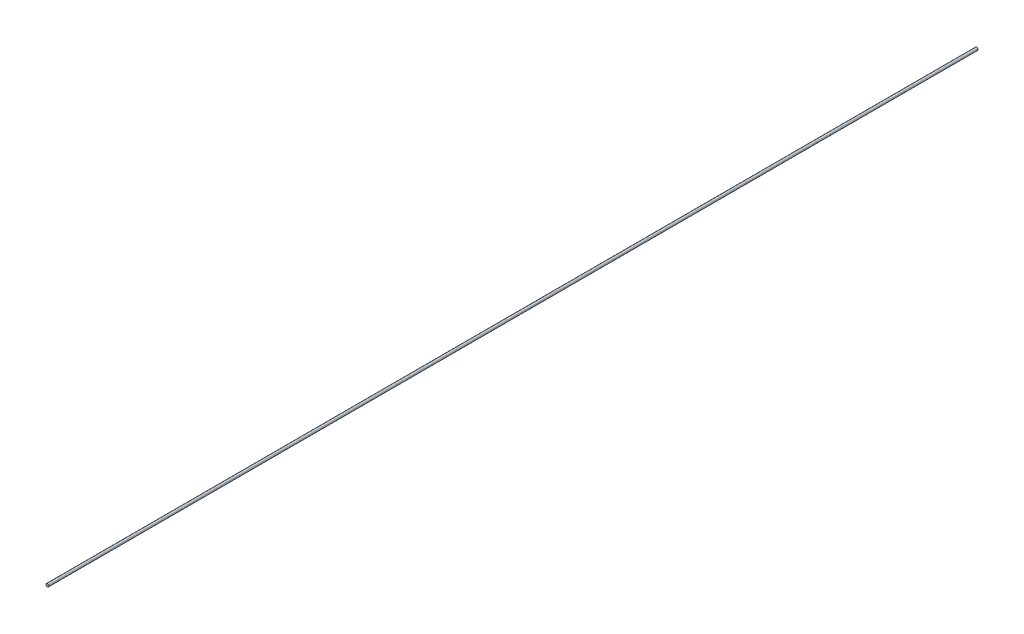
ISO-10303-21;
HEADER;
FILE_DESCRIPTION(('STEP AP214'),'2;1');
FILE_NAME('part.step','',(''),(''),'','','');
FILE_SCHEMA(('AUTOMOTIVE_DESIGN { 1 0 10303 214 1 1 1 1 }'));
ENDSEC;
DATA;
#1=APPLICATION_CONTEXT('core data for automotive mechanical design processes');
#2=APPLICATION_PROTOCOL_DEFINITION('international standard','automotive_design',2000,#1);
#3=PRODUCT_CONTEXT('',#1,'mechanical');
#4=PRODUCT('Part','Part','',(#3));
#5=PRODUCT_RELATED_PRODUCT_CATEGORY('part','',(#4));
#6=PRODUCT_DEFINITION_FORMATION('','',#4);
#7=PRODUCT_DEFINITION_CONTEXT('part definition',#1,'design');
#8=PRODUCT_DEFINITION('design','',#6,#7);
#9=PRODUCT_DEFINITION_SHAPE('','',#8);
#10=(LENGTH_UNIT() NAMED_UNIT(*) SI_UNIT(.MILLI.,.METRE.));
#11=(NAMED_UNIT(*) PLANE_ANGLE_UNIT() SI_UNIT($,.RADIAN.));
#12=(NAMED_UNIT(*) SI_UNIT($,.STERADIAN.) SOLID_ANGLE_UNIT());
#13=UNCERTAINTY_MEASURE_WITH_UNIT(LENGTH_MEASURE(1.E-05),#10,'distance_accuracy_value','');
#14=(GEOMETRIC_REPRESENTATION_CONTEXT(3) GLOBAL_UNCERTAINTY_ASSIGNED_CONTEXT((#13)) GLOBAL_UNIT_ASSIGNED_CONTEXT((#10,
#11,#12)) REPRESENTATION_CONTEXT('',''));
#15=CARTESIAN_POINT('',(0.,0.,0.));
#16=DIRECTION('',(0.,0.,1.));
#17=DIRECTION('',(1.,0.,0.));
#18=AXIS2_PLACEMENT_3D('',#15,#16,#17);
#19=CARTESIAN_POINT('',(0.,0.,16757.255214248));
#20=DIRECTION('',(0.,0.,-1.));
#21=DIRECTION('',(-1.,0.,0.));
#22=AXIS2_PLACEMENT_3D('',#19,#20,#21);
#23=CYLINDRICAL_SURFACE('',#22,25.4);
#24=CARTESIAN_POINT('',(0.,0.,16757.255214248));
#25=DIRECTION('',(0.,0.,1.));
#26=DIRECTION('',(1.,0.,0.));
#27=AXIS2_PLACEMENT_3D('',#24,#25,#26);
#28=CIRCLE('',#27,25.4);
#29=CARTESIAN_POINT('',(25.4,0.,16757.255214248));
#30=VERTEX_POINT('',#29);
#31=EDGE_CURVE('E10',#30,#30,#28,.T.);
#32=ORIENTED_EDGE('',*,*,#31,.F.);
#33=EDGE_LOOP('',(#32));
#34=FACE_BOUND('',#33,.T.);
#35=CARTESIAN_POINT('',(0.,0.,0.));
#36=DIRECTION('',(0.,0.,1.));
#37=DIRECTION('',(1.,0.,0.));
#38=AXIS2_PLACEMENT_3D('',#35,#36,#37);
#39=CIRCLE('',#38,25.4);
#40=CARTESIAN_POINT('',(25.4,0.,0.));
#41=VERTEX_POINT('',#40);
#42=EDGE_CURVE('E45',#41,#41,#39,.T.);
#43=ORIENTED_EDGE('',*,*,#42,.T.);
#44=EDGE_LOOP('',(#43));
#45=FACE_BOUND('',#44,.T.);
#46=ADVANCED_FACE('F39',(#34,#45),#23,.T.);
#47=CARTESIAN_POINT('',(0.,0.,16757.255214248));
#48=DIRECTION('',(0.,0.,1.));
#49=DIRECTION('',(1.,0.,0.));
#50=AXIS2_PLACEMENT_3D('',#47,#48,#49);
#51=PLANE('',#50);
#52=ORIENTED_EDGE('',*,*,#31,.T.);
#53=EDGE_LOOP('',(#52));
#54=FACE_BOUND('',#53,.T.);
#55=ADVANCED_FACE('F53',(#54),#51,.T.);
#56=CARTESIAN_POINT('',(0.,0.,0.));
#57=DIRECTION('',(0.,0.,1.));
#58=DIRECTION('',(1.,0.,0.));
#59=AXIS2_PLACEMENT_3D('',#56,#57,#58);
#60=PLANE('',#59);
#61=ORIENTED_EDGE('',*,*,#42,.F.);
#62=EDGE_LOOP('',(#61));
#63=FACE_BOUND('',#62,.T.);
#64=ADVANCED_FACE('F55',(#63),#60,.F.);
#65=CLOSED_SHELL('',(#46,#55,#64));
#66=MANIFOLD_SOLID_BREP('B2',#65);
#67=ADVANCED_BREP_SHAPE_REPRESENTATION('',(#18,#66),#14);
#68=SHAPE_DEFINITION_REPRESENTATION(#9,#67);
ENDSEC;
END-ISO-10303-21;
